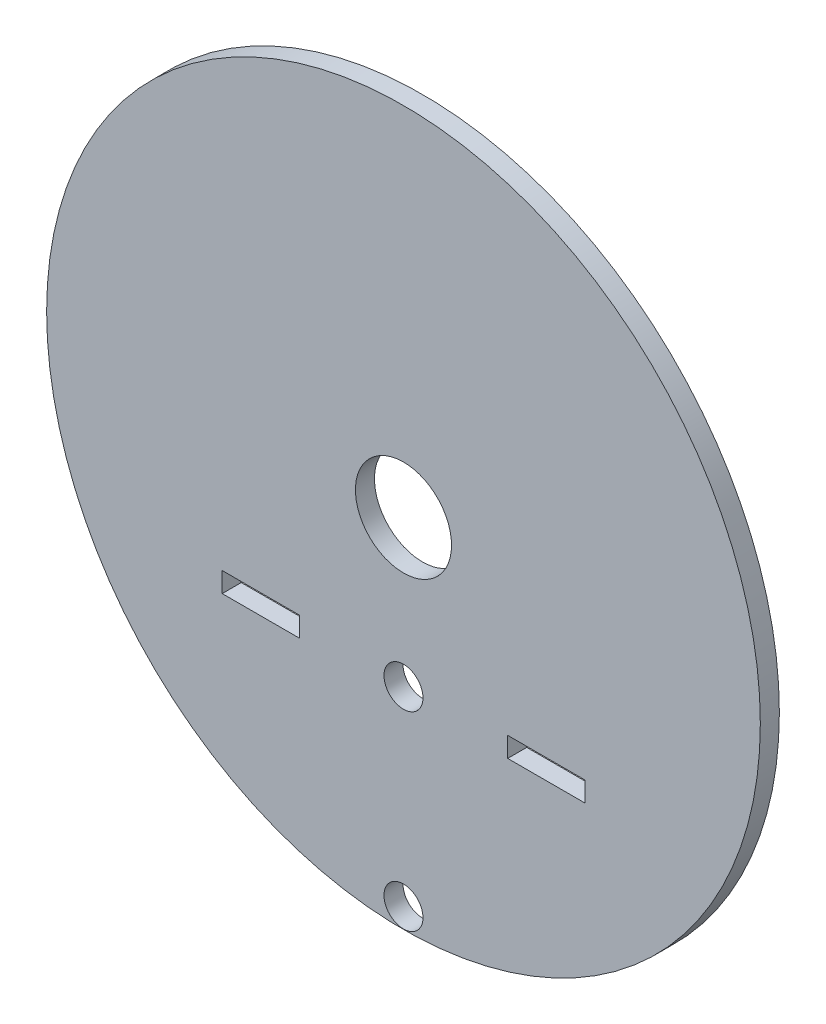
ISO-10303-21;
HEADER;
FILE_DESCRIPTION(('STEP AP214'),'2;1');
FILE_NAME('part.step','',(''),(''),'','','');
FILE_SCHEMA(('AUTOMOTIVE_DESIGN { 1 0 10303 214 1 1 1 1 }'));
ENDSEC;
DATA;
#1=APPLICATION_CONTEXT('core data for automotive mechanical design processes');
#2=APPLICATION_PROTOCOL_DEFINITION('international standard','automotive_design',2000,#1);
#3=PRODUCT_CONTEXT('',#1,'mechanical');
#4=PRODUCT('Part','Part','',(#3));
#5=PRODUCT_RELATED_PRODUCT_CATEGORY('part','',(#4));
#6=PRODUCT_DEFINITION_FORMATION('','',#4);
#7=PRODUCT_DEFINITION_CONTEXT('part definition',#1,'design');
#8=PRODUCT_DEFINITION('design','',#6,#7);
#9=PRODUCT_DEFINITION_SHAPE('','',#8);
#10=(LENGTH_UNIT() NAMED_UNIT(*) SI_UNIT(.MILLI.,.METRE.));
#11=(NAMED_UNIT(*) PLANE_ANGLE_UNIT() SI_UNIT($,.RADIAN.));
#12=(NAMED_UNIT(*) SI_UNIT($,.STERADIAN.) SOLID_ANGLE_UNIT());
#13=UNCERTAINTY_MEASURE_WITH_UNIT(LENGTH_MEASURE(1.E-05),#10,'distance_accuracy_value','');
#14=(GEOMETRIC_REPRESENTATION_CONTEXT(3) GLOBAL_UNCERTAINTY_ASSIGNED_CONTEXT((#13)) GLOBAL_UNIT_ASSIGNED_CONTEXT((#10,
#11,#12)) REPRESENTATION_CONTEXT('',''));
#15=CARTESIAN_POINT('',(0.,0.,0.));
#16=DIRECTION('',(0.,0.,1.));
#17=DIRECTION('',(1.,0.,0.));
#18=AXIS2_PLACEMENT_3D('',#15,#16,#17);
#19=CARTESIAN_POINT('',(0.,35.4,2.));
#20=DIRECTION('',(0.,0.,1.));
#21=DIRECTION('',(1.,0.,0.));
#22=AXIS2_PLACEMENT_3D('',#19,#20,#21);
#23=PLANE('',#22);
#24=DIRECTION('',(0.,-1.,0.));
#25=VECTOR('',#24,1.);
#26=CARTESIAN_POINT('',(10.95,21.05,2.));
#27=LINE('',#26,#25);
#28=CARTESIAN_POINT('',(10.95,21.05,2.));
#29=VERTEX_POINT('',#28);
#30=CARTESIAN_POINT('',(10.95,18.95,2.));
#31=VERTEX_POINT('',#30);
#32=EDGE_CURVE('E108',#29,#31,#27,.T.);
#33=ORIENTED_EDGE('',*,*,#32,.F.);
#34=DIRECTION('',(-1.,0.,0.));
#35=VECTOR('',#34,1.);
#36=CARTESIAN_POINT('',(19.05,21.05,2.));
#37=LINE('',#36,#35);
#38=CARTESIAN_POINT('',(19.05,21.05,2.));
#39=VERTEX_POINT('',#38);
#40=EDGE_CURVE('E100',#39,#29,#37,.T.);
#41=ORIENTED_EDGE('',*,*,#40,.F.);
#42=DIRECTION('',(0.,1.,0.));
#43=VECTOR('',#42,1.);
#44=CARTESIAN_POINT('',(19.05,21.05,2.));
#45=LINE('',#44,#43);
#46=CARTESIAN_POINT('',(19.05,18.95,2.));
#47=VERTEX_POINT('',#46);
#48=EDGE_CURVE('E123',#47,#39,#45,.T.);
#49=ORIENTED_EDGE('',*,*,#48,.F.);
#50=DIRECTION('',(1.,0.,0.));
#51=VECTOR('',#50,1.);
#52=CARTESIAN_POINT('',(19.05,18.95,2.));
#53=LINE('',#52,#51);
#54=EDGE_CURVE('E121',#31,#47,#53,.T.);
#55=ORIENTED_EDGE('',*,*,#54,.F.);
#56=EDGE_LOOP('',(#33,#41,#49,#55));
#57=FACE_BOUND('',#56,.T.);
#58=DIRECTION('',(-1.,0.,0.));
#59=VECTOR('',#58,1.);
#60=CARTESIAN_POINT('',(-19.05,21.05,2.));
#61=LINE('',#60,#59);
#62=CARTESIAN_POINT('',(-10.95,21.05,2.));
#63=VERTEX_POINT('',#62);
#64=CARTESIAN_POINT('',(-19.05,21.05,2.));
#65=VERTEX_POINT('',#64);
#66=EDGE_CURVE('E141',#63,#65,#61,.T.);
#67=ORIENTED_EDGE('',*,*,#66,.F.);
#68=DIRECTION('',(0.,1.,0.));
#69=VECTOR('',#68,1.);
#70=CARTESIAN_POINT('',(-10.95,21.05,2.));
#71=LINE('',#70,#69);
#72=CARTESIAN_POINT('',(-10.95,18.95,2.));
#73=VERTEX_POINT('',#72);
#74=EDGE_CURVE('E139',#73,#63,#71,.T.);
#75=ORIENTED_EDGE('',*,*,#74,.F.);
#76=DIRECTION('',(1.,0.,0.));
#77=VECTOR('',#76,1.);
#78=CARTESIAN_POINT('',(-19.05,18.95,2.));
#79=LINE('',#78,#77);
#80=CARTESIAN_POINT('',(-19.05,18.95,2.));
#81=VERTEX_POINT('',#80);
#82=EDGE_CURVE('E147',#81,#73,#79,.T.);
#83=ORIENTED_EDGE('',*,*,#82,.F.);
#84=DIRECTION('',(0.,-1.,0.));
#85=VECTOR('',#84,1.);
#86=CARTESIAN_POINT('',(-19.05,21.05,2.));
#87=LINE('',#86,#85);
#88=EDGE_CURVE('E144',#65,#81,#87,.T.);
#89=ORIENTED_EDGE('',*,*,#88,.F.);
#90=EDGE_LOOP('',(#67,#75,#83,#89));
#91=FACE_BOUND('',#90,.T.);
#92=CARTESIAN_POINT('',(0.,20.,2.));
#93=DIRECTION('',(0.,0.,1.));
#94=DIRECTION('',(1.,0.,0.));
#95=AXIS2_PLACEMENT_3D('',#92,#93,#94);
#96=CIRCLE('',#95,2.05);
#97=CARTESIAN_POINT('',(2.05,20.,2.));
#98=VERTEX_POINT('',#97);
#99=EDGE_CURVE('E170',#98,#98,#96,.T.);
#100=ORIENTED_EDGE('',*,*,#99,.F.);
#101=EDGE_LOOP('',(#100));
#102=FACE_BOUND('',#101,.T.);
#103=CARTESIAN_POINT('',(0.,35.4,2.));
#104=DIRECTION('',(0.,0.,1.));
#105=DIRECTION('',(1.,0.,0.));
#106=AXIS2_PLACEMENT_3D('',#103,#104,#105);
#107=CIRCLE('',#106,37.5);
#108=CARTESIAN_POINT('',(37.5,35.4,2.));
#109=VERTEX_POINT('',#108);
#110=EDGE_CURVE('E11',#109,#109,#107,.T.);
#111=ORIENTED_EDGE('',*,*,#110,.T.);
#112=EDGE_LOOP('',(#111));
#113=FACE_BOUND('',#112,.T.);
#114=CARTESIAN_POINT('',(0.,0.,2.));
#115=DIRECTION('',(0.,0.,1.));
#116=DIRECTION('',(1.,0.,0.));
#117=AXIS2_PLACEMENT_3D('',#114,#115,#116);
#118=CIRCLE('',#117,2.05);
#119=CARTESIAN_POINT('',(2.05,0.,2.));
#120=VERTEX_POINT('',#119);
#121=EDGE_CURVE('E176',#120,#120,#118,.T.);
#122=ORIENTED_EDGE('',*,*,#121,.F.);
#123=EDGE_LOOP('',(#122));
#124=FACE_BOUND('',#123,.T.);
#125=CARTESIAN_POINT('',(0.,35.4,2.));
#126=DIRECTION('',(0.,0.,1.));
#127=DIRECTION('',(1.,0.,0.));
#128=AXIS2_PLACEMENT_3D('',#125,#126,#127);
#129=CIRCLE('',#128,5.05);
#130=CARTESIAN_POINT('',(5.05,35.4,2.));
#131=VERTEX_POINT('',#130);
#132=EDGE_CURVE('E129',#131,#131,#129,.T.);
#133=ORIENTED_EDGE('',*,*,#132,.F.);
#134=EDGE_LOOP('',(#133));
#135=FACE_BOUND('',#134,.T.);
#136=ADVANCED_FACE('F35',(#57,#91,#102,#113,#124,#135),#23,.T.);
#137=CARTESIAN_POINT('',(0.,35.4,0.));
#138=DIRECTION('',(0.,0.,1.));
#139=DIRECTION('',(1.,0.,0.));
#140=AXIS2_PLACEMENT_3D('',#137,#138,#139);
#141=PLANE('',#140);
#142=DIRECTION('',(0.,1.,0.));
#143=VECTOR('',#142,1.);
#144=CARTESIAN_POINT('',(-10.95,21.05,0.));
#145=LINE('',#144,#143);
#146=CARTESIAN_POINT('',(-10.95,18.95,0.));
#147=VERTEX_POINT('',#146);
#148=CARTESIAN_POINT('',(-10.95,21.05,0.));
#149=VERTEX_POINT('',#148);
#150=EDGE_CURVE('E116',#147,#149,#145,.T.);
#151=ORIENTED_EDGE('',*,*,#150,.T.);
#152=DIRECTION('',(-1.,0.,0.));
#153=VECTOR('',#152,1.);
#154=CARTESIAN_POINT('',(-19.05,21.05,0.));
#155=LINE('',#154,#153);
#156=CARTESIAN_POINT('',(-19.05,21.05,0.));
#157=VERTEX_POINT('',#156);
#158=EDGE_CURVE('E152',#149,#157,#155,.T.);
#159=ORIENTED_EDGE('',*,*,#158,.T.);
#160=DIRECTION('',(0.,-1.,0.));
#161=VECTOR('',#160,1.);
#162=CARTESIAN_POINT('',(-19.05,21.05,0.));
#163=LINE('',#162,#161);
#164=CARTESIAN_POINT('',(-19.05,18.95,0.));
#165=VERTEX_POINT('',#164);
#166=EDGE_CURVE('E155',#157,#165,#163,.T.);
#167=ORIENTED_EDGE('',*,*,#166,.T.);
#168=DIRECTION('',(1.,0.,0.));
#169=VECTOR('',#168,1.);
#170=CARTESIAN_POINT('',(-19.05,18.95,0.));
#171=LINE('',#170,#169);
#172=EDGE_CURVE('E142',#165,#147,#171,.T.);
#173=ORIENTED_EDGE('',*,*,#172,.T.);
#174=EDGE_LOOP('',(#151,#159,#167,#173));
#175=FACE_BOUND('',#174,.T.);
#176=CARTESIAN_POINT('',(0.,35.4,0.));
#177=DIRECTION('',(0.,0.,1.));
#178=DIRECTION('',(1.,0.,0.));
#179=AXIS2_PLACEMENT_3D('',#176,#177,#178);
#180=CIRCLE('',#179,37.5);
#181=CARTESIAN_POINT('',(37.5,35.4,0.));
#182=VERTEX_POINT('',#181);
#183=EDGE_CURVE('E39',#182,#182,#180,.T.);
#184=ORIENTED_EDGE('',*,*,#183,.F.);
#185=EDGE_LOOP('',(#184));
#186=FACE_BOUND('',#185,.T.);
#187=CARTESIAN_POINT('',(0.,0.,0.));
#188=DIRECTION('',(0.,0.,1.));
#189=DIRECTION('',(1.,0.,0.));
#190=AXIS2_PLACEMENT_3D('',#187,#188,#189);
#191=CIRCLE('',#190,2.05);
#192=CARTESIAN_POINT('',(2.05,0.,0.));
#193=VERTEX_POINT('',#192);
#194=EDGE_CURVE('E173',#193,#193,#191,.T.);
#195=ORIENTED_EDGE('',*,*,#194,.T.);
#196=EDGE_LOOP('',(#195));
#197=FACE_BOUND('',#196,.T.);
#198=CARTESIAN_POINT('',(0.,20.,0.));
#199=DIRECTION('',(0.,0.,1.));
#200=DIRECTION('',(1.,0.,0.));
#201=AXIS2_PLACEMENT_3D('',#198,#199,#200);
#202=CIRCLE('',#201,2.05);
#203=CARTESIAN_POINT('',(2.05,20.,0.));
#204=VERTEX_POINT('',#203);
#205=EDGE_CURVE('E169',#204,#204,#202,.T.);
#206=ORIENTED_EDGE('',*,*,#205,.T.);
#207=EDGE_LOOP('',(#206));
#208=FACE_BOUND('',#207,.T.);
#209=DIRECTION('',(-1.,0.,0.));
#210=VECTOR('',#209,1.);
#211=CARTESIAN_POINT('',(19.05,21.05,0.));
#212=LINE('',#211,#210);
#213=CARTESIAN_POINT('',(19.05,21.05,0.));
#214=VERTEX_POINT('',#213);
#215=CARTESIAN_POINT('',(10.95,21.05,0.));
#216=VERTEX_POINT('',#215);
#217=EDGE_CURVE('E58',#214,#216,#212,.T.);
#218=ORIENTED_EDGE('',*,*,#217,.T.);
#219=DIRECTION('',(0.,-1.,0.));
#220=VECTOR('',#219,1.);
#221=CARTESIAN_POINT('',(10.95,21.05,0.));
#222=LINE('',#221,#220);
#223=CARTESIAN_POINT('',(10.95,18.95,0.));
#224=VERTEX_POINT('',#223);
#225=EDGE_CURVE('E115',#216,#224,#222,.T.);
#226=ORIENTED_EDGE('',*,*,#225,.T.);
#227=DIRECTION('',(1.,0.,0.));
#228=VECTOR('',#227,1.);
#229=CARTESIAN_POINT('',(19.05,18.95,0.));
#230=LINE('',#229,#228);
#231=CARTESIAN_POINT('',(19.05,18.95,0.));
#232=VERTEX_POINT('',#231);
#233=EDGE_CURVE('E131',#224,#232,#230,.T.);
#234=ORIENTED_EDGE('',*,*,#233,.T.);
#235=DIRECTION('',(0.,1.,0.));
#236=VECTOR('',#235,1.);
#237=CARTESIAN_POINT('',(19.05,21.05,0.));
#238=LINE('',#237,#236);
#239=EDGE_CURVE('E109',#232,#214,#238,.T.);
#240=ORIENTED_EDGE('',*,*,#239,.T.);
#241=EDGE_LOOP('',(#218,#226,#234,#240));
#242=FACE_BOUND('',#241,.T.);
#243=CARTESIAN_POINT('',(0.,35.4,0.));
#244=DIRECTION('',(0.,0.,1.));
#245=DIRECTION('',(1.,0.,0.));
#246=AXIS2_PLACEMENT_3D('',#243,#244,#245);
#247=CIRCLE('',#246,5.05);
#248=CARTESIAN_POINT('',(5.05,35.4,0.));
#249=VERTEX_POINT('',#248);
#250=EDGE_CURVE('E309',#249,#249,#247,.T.);
#251=ORIENTED_EDGE('',*,*,#250,.T.);
#252=EDGE_LOOP('',(#251));
#253=FACE_BOUND('',#252,.T.);
#254=ADVANCED_FACE('F182',(#175,#186,#197,#208,#242,#253),#141,.F.);
#255=CARTESIAN_POINT('',(0.,35.4,2.));
#256=DIRECTION('',(0.,0.,-1.));
#257=DIRECTION('',(-1.,0.,0.));
#258=AXIS2_PLACEMENT_3D('',#255,#256,#257);
#259=CYLINDRICAL_SURFACE('',#258,37.5);
#260=ORIENTED_EDGE('',*,*,#110,.F.);
#261=EDGE_LOOP('',(#260));
#262=FACE_BOUND('',#261,.T.);
#263=ORIENTED_EDGE('',*,*,#183,.T.);
#264=EDGE_LOOP('',(#263));
#265=FACE_BOUND('',#264,.T.);
#266=ADVANCED_FACE('F37',(#262,#265),#259,.T.);
#267=CARTESIAN_POINT('',(0.,0.,2.));
#268=DIRECTION('',(0.,0.,-1.));
#269=DIRECTION('',(-1.,0.,0.));
#270=AXIS2_PLACEMENT_3D('',#267,#268,#269);
#271=CYLINDRICAL_SURFACE('',#270,2.05);
#272=ORIENTED_EDGE('',*,*,#121,.T.);
#273=EDGE_LOOP('',(#272));
#274=FACE_BOUND('',#273,.T.);
#275=ORIENTED_EDGE('',*,*,#194,.F.);
#276=EDGE_LOOP('',(#275));
#277=FACE_BOUND('',#276,.T.);
#278=ADVANCED_FACE('F185',(#274,#277),#271,.F.);
#279=CARTESIAN_POINT('',(0.,20.,2.));
#280=DIRECTION('',(0.,0.,-1.));
#281=DIRECTION('',(-1.,0.,0.));
#282=AXIS2_PLACEMENT_3D('',#279,#280,#281);
#283=CYLINDRICAL_SURFACE('',#282,2.05);
#284=ORIENTED_EDGE('',*,*,#99,.T.);
#285=EDGE_LOOP('',(#284));
#286=FACE_BOUND('',#285,.T.);
#287=ORIENTED_EDGE('',*,*,#205,.F.);
#288=EDGE_LOOP('',(#287));
#289=FACE_BOUND('',#288,.T.);
#290=ADVANCED_FACE('F187',(#286,#289),#283,.F.);
#291=CARTESIAN_POINT('',(-10.95,21.05,2.));
#292=DIRECTION('',(-1.,0.,0.));
#293=DIRECTION('',(0.,0.,1.));
#294=AXIS2_PLACEMENT_3D('',#291,#292,#293);
#295=PLANE('',#294);
#296=ORIENTED_EDGE('',*,*,#150,.F.);
#297=DIRECTION('',(0.,0.,-1.));
#298=VECTOR('',#297,1.);
#299=CARTESIAN_POINT('',(-10.95,18.95,2.));
#300=LINE('',#299,#298);
#301=EDGE_CURVE('E149',#73,#147,#300,.T.);
#302=ORIENTED_EDGE('',*,*,#301,.F.);
#303=ORIENTED_EDGE('',*,*,#74,.T.);
#304=DIRECTION('',(0.,0.,-1.));
#305=VECTOR('',#304,1.);
#306=CARTESIAN_POINT('',(-10.95,21.05,2.));
#307=LINE('',#306,#305);
#308=EDGE_CURVE('E166',#63,#149,#307,.T.);
#309=ORIENTED_EDGE('',*,*,#308,.T.);
#310=EDGE_LOOP('',(#296,#302,#303,#309));
#311=FACE_BOUND('',#310,.T.);
#312=ADVANCED_FACE('F194',(#311),#295,.T.);
#313=CARTESIAN_POINT('',(-19.05,21.05,2.));
#314=DIRECTION('',(0.,-1.,0.));
#315=DIRECTION('',(0.,0.,-1.));
#316=AXIS2_PLACEMENT_3D('',#313,#314,#315);
#317=PLANE('',#316);
#318=ORIENTED_EDGE('',*,*,#158,.F.);
#319=ORIENTED_EDGE('',*,*,#308,.F.);
#320=ORIENTED_EDGE('',*,*,#66,.T.);
#321=DIRECTION('',(0.,0.,-1.));
#322=VECTOR('',#321,1.);
#323=CARTESIAN_POINT('',(-19.05,21.05,2.));
#324=LINE('',#323,#322);
#325=EDGE_CURVE('E164',#65,#157,#324,.T.);
#326=ORIENTED_EDGE('',*,*,#325,.T.);
#327=EDGE_LOOP('',(#318,#319,#320,#326));
#328=FACE_BOUND('',#327,.T.);
#329=ADVANCED_FACE('F222',(#328),#317,.T.);
#330=CARTESIAN_POINT('',(-19.05,21.05,2.));
#331=DIRECTION('',(1.,0.,0.));
#332=DIRECTION('',(0.,0.,-1.));
#333=AXIS2_PLACEMENT_3D('',#330,#331,#332);
#334=PLANE('',#333);
#335=ORIENTED_EDGE('',*,*,#166,.F.);
#336=ORIENTED_EDGE('',*,*,#325,.F.);
#337=ORIENTED_EDGE('',*,*,#88,.T.);
#338=DIRECTION('',(0.,0.,-1.));
#339=VECTOR('',#338,1.);
#340=CARTESIAN_POINT('',(-19.05,18.95,2.));
#341=LINE('',#340,#339);
#342=EDGE_CURVE('E162',#81,#165,#341,.T.);
#343=ORIENTED_EDGE('',*,*,#342,.T.);
#344=EDGE_LOOP('',(#335,#336,#337,#343));
#345=FACE_BOUND('',#344,.T.);
#346=ADVANCED_FACE('F226',(#345),#334,.T.);
#347=CARTESIAN_POINT('',(-19.05,18.95,2.));
#348=DIRECTION('',(0.,1.,0.));
#349=DIRECTION('',(0.,0.,1.));
#350=AXIS2_PLACEMENT_3D('',#347,#348,#349);
#351=PLANE('',#350);
#352=ORIENTED_EDGE('',*,*,#172,.F.);
#353=ORIENTED_EDGE('',*,*,#342,.F.);
#354=ORIENTED_EDGE('',*,*,#82,.T.);
#355=ORIENTED_EDGE('',*,*,#301,.T.);
#356=EDGE_LOOP('',(#352,#353,#354,#355));
#357=FACE_BOUND('',#356,.T.);
#358=ADVANCED_FACE('F216',(#357),#351,.T.);
#359=CARTESIAN_POINT('',(19.05,21.05,2.));
#360=DIRECTION('',(0.,-1.,0.));
#361=DIRECTION('',(0.,0.,-1.));
#362=AXIS2_PLACEMENT_3D('',#359,#360,#361);
#363=PLANE('',#362);
#364=ORIENTED_EDGE('',*,*,#217,.F.);
#365=DIRECTION('',(0.,0.,-1.));
#366=VECTOR('',#365,1.);
#367=CARTESIAN_POINT('',(19.05,21.05,2.));
#368=LINE('',#367,#366);
#369=EDGE_CURVE('E104',#39,#214,#368,.T.);
#370=ORIENTED_EDGE('',*,*,#369,.F.);
#371=ORIENTED_EDGE('',*,*,#40,.T.);
#372=DIRECTION('',(0.,0.,-1.));
#373=VECTOR('',#372,1.);
#374=CARTESIAN_POINT('',(10.95,21.05,2.));
#375=LINE('',#374,#373);
#376=EDGE_CURVE('E103',#29,#216,#375,.T.);
#377=ORIENTED_EDGE('',*,*,#376,.T.);
#378=EDGE_LOOP('',(#364,#370,#371,#377));
#379=FACE_BOUND('',#378,.T.);
#380=ADVANCED_FACE('F102',(#379),#363,.T.);
#381=CARTESIAN_POINT('',(10.95,21.05,2.));
#382=DIRECTION('',(1.,0.,0.));
#383=DIRECTION('',(0.,0.,-1.));
#384=AXIS2_PLACEMENT_3D('',#381,#382,#383);
#385=PLANE('',#384);
#386=ORIENTED_EDGE('',*,*,#225,.F.);
#387=ORIENTED_EDGE('',*,*,#376,.F.);
#388=ORIENTED_EDGE('',*,*,#32,.T.);
#389=DIRECTION('',(0.,0.,-1.));
#390=VECTOR('',#389,1.);
#391=CARTESIAN_POINT('',(10.95,18.95,2.));
#392=LINE('',#391,#390);
#393=EDGE_CURVE('E117',#31,#224,#392,.T.);
#394=ORIENTED_EDGE('',*,*,#393,.T.);
#395=EDGE_LOOP('',(#386,#387,#388,#394));
#396=FACE_BOUND('',#395,.T.);
#397=ADVANCED_FACE('F112',(#396),#385,.T.);
#398=CARTESIAN_POINT('',(19.05,18.95,2.));
#399=DIRECTION('',(0.,1.,0.));
#400=DIRECTION('',(0.,0.,1.));
#401=AXIS2_PLACEMENT_3D('',#398,#399,#400);
#402=PLANE('',#401);
#403=ORIENTED_EDGE('',*,*,#233,.F.);
#404=ORIENTED_EDGE('',*,*,#393,.F.);
#405=ORIENTED_EDGE('',*,*,#54,.T.);
#406=DIRECTION('',(0.,0.,-1.));
#407=VECTOR('',#406,1.);
#408=CARTESIAN_POINT('',(19.05,18.95,2.));
#409=LINE('',#408,#407);
#410=EDGE_CURVE('E50',#47,#232,#409,.T.);
#411=ORIENTED_EDGE('',*,*,#410,.T.);
#412=EDGE_LOOP('',(#403,#404,#405,#411));
#413=FACE_BOUND('',#412,.T.);
#414=ADVANCED_FACE('F272',(#413),#402,.T.);
#415=CARTESIAN_POINT('',(19.05,21.05,2.));
#416=DIRECTION('',(-1.,0.,0.));
#417=DIRECTION('',(0.,0.,1.));
#418=AXIS2_PLACEMENT_3D('',#415,#416,#417);
#419=PLANE('',#418);
#420=ORIENTED_EDGE('',*,*,#239,.F.);
#421=ORIENTED_EDGE('',*,*,#410,.F.);
#422=ORIENTED_EDGE('',*,*,#48,.T.);
#423=ORIENTED_EDGE('',*,*,#369,.T.);
#424=EDGE_LOOP('',(#420,#421,#422,#423));
#425=FACE_BOUND('',#424,.T.);
#426=ADVANCED_FACE('F281',(#425),#419,.T.);
#427=CARTESIAN_POINT('',(0.,35.4,2.));
#428=DIRECTION('',(0.,0.,-1.));
#429=DIRECTION('',(-1.,0.,0.));
#430=AXIS2_PLACEMENT_3D('',#427,#428,#429);
#431=CYLINDRICAL_SURFACE('',#430,5.05);
#432=ORIENTED_EDGE('',*,*,#132,.T.);
#433=EDGE_LOOP('',(#432));
#434=FACE_BOUND('',#433,.T.);
#435=ORIENTED_EDGE('',*,*,#250,.F.);
#436=EDGE_LOOP('',(#435));
#437=FACE_BOUND('',#436,.T.);
#438=ADVANCED_FACE('F291',(#434,#437),#431,.F.);
#439=CLOSED_SHELL('',(#136,#254,#266,#278,#290,#312,#329,#346,#358,#380,#397,#414,#426,#438));
#440=MANIFOLD_SOLID_BREP('B2',#439);
#441=ADVANCED_BREP_SHAPE_REPRESENTATION('',(#18,#440),#14);
#442=SHAPE_DEFINITION_REPRESENTATION(#9,#441);
ENDSEC;
END-ISO-10303-21;
